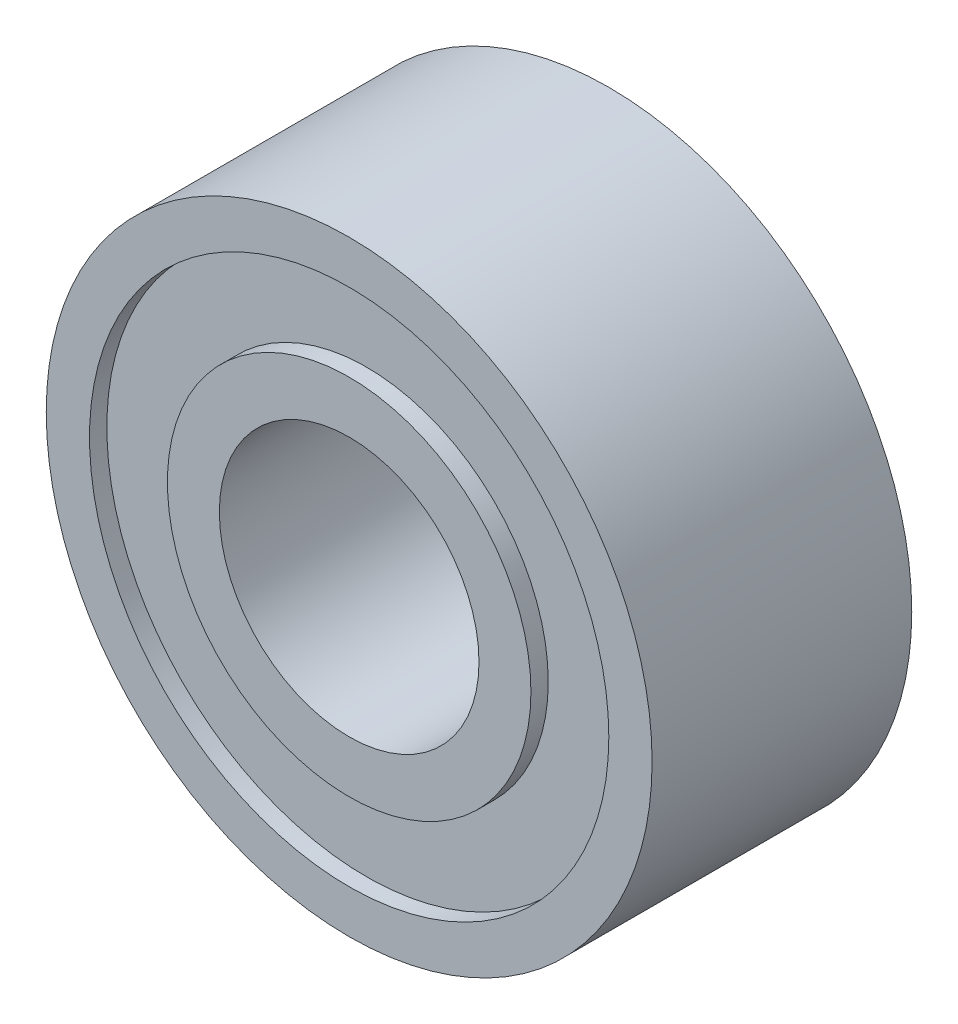
ISO-10303-21;
HEADER;
FILE_DESCRIPTION(('STEP AP214'),'2;1');
FILE_NAME('part.step','',(''),(''),'','','');
FILE_SCHEMA(('AUTOMOTIVE_DESIGN { 1 0 10303 214 1 1 1 1 }'));
ENDSEC;
DATA;
#1=APPLICATION_CONTEXT('core data for automotive mechanical design processes');
#2=APPLICATION_PROTOCOL_DEFINITION('international standard','automotive_design',2000,#1);
#3=PRODUCT_CONTEXT('',#1,'mechanical');
#4=PRODUCT('Part','Part','',(#3));
#5=PRODUCT_RELATED_PRODUCT_CATEGORY('part','',(#4));
#6=PRODUCT_DEFINITION_FORMATION('','',#4);
#7=PRODUCT_DEFINITION_CONTEXT('part definition',#1,'design');
#8=PRODUCT_DEFINITION('design','',#6,#7);
#9=PRODUCT_DEFINITION_SHAPE('','',#8);
#10=(LENGTH_UNIT() NAMED_UNIT(*) SI_UNIT(.MILLI.,.METRE.));
#11=(NAMED_UNIT(*) PLANE_ANGLE_UNIT() SI_UNIT($,.RADIAN.));
#12=(NAMED_UNIT(*) SI_UNIT($,.STERADIAN.) SOLID_ANGLE_UNIT());
#13=UNCERTAINTY_MEASURE_WITH_UNIT(LENGTH_MEASURE(1.E-05),#10,'distance_accuracy_value','');
#14=(GEOMETRIC_REPRESENTATION_CONTEXT(3) GLOBAL_UNCERTAINTY_ASSIGNED_CONTEXT((#13)) GLOBAL_UNIT_ASSIGNED_CONTEXT((#10,
#11,#12)) REPRESENTATION_CONTEXT('',''));
#15=CARTESIAN_POINT('',(0.,0.,0.));
#16=DIRECTION('',(0.,0.,1.));
#17=DIRECTION('',(1.,0.,0.));
#18=AXIS2_PLACEMENT_3D('',#15,#16,#17);
#19=CARTESIAN_POINT('',(0.,0.,0.));
#20=DIRECTION('',(0.,0.,1.));
#21=DIRECTION('',(1.,0.,0.));
#22=AXIS2_PLACEMENT_3D('',#19,#20,#21);
#23=PLANE('',#22);
#24=CARTESIAN_POINT('',(0.,0.,0.));
#25=DIRECTION('',(0.,0.,1.));
#26=DIRECTION('',(1.,0.,0.));
#27=AXIS2_PLACEMENT_3D('',#24,#25,#26);
#28=CIRCLE('',#27,7.5);
#29=CARTESIAN_POINT('',(7.5,0.,0.));
#30=VERTEX_POINT('',#29);
#31=EDGE_CURVE('E44',#30,#30,#28,.T.);
#32=ORIENTED_EDGE('',*,*,#31,.T.);
#33=EDGE_LOOP('',(#32));
#34=FACE_BOUND('',#33,.T.);
#35=CARTESIAN_POINT('',(0.,0.,0.));
#36=DIRECTION('',(0.,0.,-1.));
#37=DIRECTION('',(-1.,0.,0.));
#38=AXIS2_PLACEMENT_3D('',#35,#36,#37);
#39=CIRCLE('',#38,10.5);
#40=CARTESIAN_POINT('',(-10.5,0.,0.));
#41=VERTEX_POINT('',#40);
#42=EDGE_CURVE('E68',#41,#41,#39,.T.);
#43=ORIENTED_EDGE('',*,*,#42,.T.);
#44=EDGE_LOOP('',(#43));
#45=FACE_BOUND('',#44,.T.);
#46=ADVANCED_FACE('F31',(#34,#45),#23,.F.);
#47=CARTESIAN_POINT('',(0.,0.,15.));
#48=DIRECTION('',(0.,0.,1.));
#49=DIRECTION('',(1.,0.,0.));
#50=AXIS2_PLACEMENT_3D('',#47,#48,#49);
#51=PLANE('',#50);
#52=CARTESIAN_POINT('',(0.,0.,15.));
#53=DIRECTION('',(0.,0.,1.));
#54=DIRECTION('',(1.,0.,0.));
#55=AXIS2_PLACEMENT_3D('',#52,#53,#54);
#56=CIRCLE('',#55,7.5);
#57=CARTESIAN_POINT('',(7.5,0.,15.));
#58=VERTEX_POINT('',#57);
#59=EDGE_CURVE('E42',#58,#58,#56,.T.);
#60=ORIENTED_EDGE('',*,*,#59,.F.);
#61=EDGE_LOOP('',(#60));
#62=FACE_BOUND('',#61,.T.);
#63=CARTESIAN_POINT('',(0.,0.,15.));
#64=DIRECTION('',(0.,0.,1.));
#65=DIRECTION('',(1.,0.,0.));
#66=AXIS2_PLACEMENT_3D('',#63,#64,#65);
#67=CIRCLE('',#66,10.5);
#68=CARTESIAN_POINT('',(10.5,0.,15.));
#69=VERTEX_POINT('',#68);
#70=EDGE_CURVE('E56',#69,#69,#67,.T.);
#71=ORIENTED_EDGE('',*,*,#70,.T.);
#72=EDGE_LOOP('',(#71));
#73=FACE_BOUND('',#72,.T.);
#74=ADVANCED_FACE('F106',(#62,#73),#51,.T.);
#75=CARTESIAN_POINT('',(0.,0.,15.));
#76=DIRECTION('',(0.,0.,1.));
#77=DIRECTION('',(1.,0.,0.));
#78=AXIS2_PLACEMENT_3D('',#75,#76,#77);
#79=CIRCLE('',#78,15.);
#80=CARTESIAN_POINT('',(15.,0.,15.));
#81=VERTEX_POINT('',#80);
#82=EDGE_CURVE('E50',#81,#81,#79,.T.);
#83=ORIENTED_EDGE('',*,*,#82,.F.);
#84=EDGE_LOOP('',(#83));
#85=FACE_BOUND('',#84,.T.);
#86=CARTESIAN_POINT('',(0.,0.,15.));
#87=DIRECTION('',(0.,0.,1.));
#88=DIRECTION('',(1.,0.,0.));
#89=AXIS2_PLACEMENT_3D('',#86,#87,#88);
#90=CIRCLE('',#89,17.5);
#91=CARTESIAN_POINT('',(17.5,0.,15.));
#92=VERTEX_POINT('',#91);
#93=EDGE_CURVE('E10',#92,#92,#90,.T.);
#94=ORIENTED_EDGE('',*,*,#93,.T.);
#95=EDGE_LOOP('',(#94));
#96=FACE_BOUND('',#95,.T.);
#97=ADVANCED_FACE('F93',(#85,#96),#51,.T.);
#98=CARTESIAN_POINT('',(0.,0.,0.));
#99=DIRECTION('',(0.,0.,-1.));
#100=DIRECTION('',(-1.,0.,0.));
#101=AXIS2_PLACEMENT_3D('',#98,#99,#100);
#102=CIRCLE('',#101,15.);
#103=CARTESIAN_POINT('',(-15.,0.,0.));
#104=VERTEX_POINT('',#103);
#105=EDGE_CURVE('E62',#104,#104,#102,.T.);
#106=ORIENTED_EDGE('',*,*,#105,.F.);
#107=EDGE_LOOP('',(#106));
#108=FACE_BOUND('',#107,.T.);
#109=CARTESIAN_POINT('',(0.,0.,0.));
#110=DIRECTION('',(0.,0.,1.));
#111=DIRECTION('',(1.,0.,0.));
#112=AXIS2_PLACEMENT_3D('',#109,#110,#111);
#113=CIRCLE('',#112,17.5);
#114=CARTESIAN_POINT('',(17.5,0.,0.));
#115=VERTEX_POINT('',#114);
#116=EDGE_CURVE('E35',#115,#115,#113,.T.);
#117=ORIENTED_EDGE('',*,*,#116,.F.);
#118=EDGE_LOOP('',(#117));
#119=FACE_BOUND('',#118,.T.);
#120=ADVANCED_FACE('F90',(#108,#119),#23,.F.);
#121=CARTESIAN_POINT('',(0.,0.,15.));
#122=DIRECTION('',(0.,0.,-1.));
#123=DIRECTION('',(-1.,0.,0.));
#124=AXIS2_PLACEMENT_3D('',#121,#122,#123);
#125=CYLINDRICAL_SURFACE('',#124,17.5);
#126=ORIENTED_EDGE('',*,*,#93,.F.);
#127=EDGE_LOOP('',(#126));
#128=FACE_BOUND('',#127,.T.);
#129=ORIENTED_EDGE('',*,*,#116,.T.);
#130=EDGE_LOOP('',(#129));
#131=FACE_BOUND('',#130,.T.);
#132=ADVANCED_FACE('F33',(#128,#131),#125,.T.);
#133=CARTESIAN_POINT('',(0.,0.,15.));
#134=DIRECTION('',(0.,0.,-1.));
#135=DIRECTION('',(-1.,0.,0.));
#136=AXIS2_PLACEMENT_3D('',#133,#134,#135);
#137=CYLINDRICAL_SURFACE('',#136,7.5);
#138=ORIENTED_EDGE('',*,*,#59,.T.);
#139=EDGE_LOOP('',(#138));
#140=FACE_BOUND('',#139,.T.);
#141=ORIENTED_EDGE('',*,*,#31,.F.);
#142=EDGE_LOOP('',(#141));
#143=FACE_BOUND('',#142,.T.);
#144=ADVANCED_FACE('F97',(#140,#143),#137,.F.);
#145=CARTESIAN_POINT('',(0.,0.,14.));
#146=DIRECTION('',(0.,0.,1.));
#147=DIRECTION('',(1.,0.,0.));
#148=AXIS2_PLACEMENT_3D('',#145,#146,#147);
#149=CYLINDRICAL_SURFACE('',#148,15.);
#150=CARTESIAN_POINT('',(0.,0.,14.));
#151=DIRECTION('',(0.,0.,1.));
#152=DIRECTION('',(1.,0.,0.));
#153=AXIS2_PLACEMENT_3D('',#150,#151,#152);
#154=CIRCLE('',#153,15.);
#155=CARTESIAN_POINT('',(15.,0.,14.));
#156=VERTEX_POINT('',#155);
#157=EDGE_CURVE('E47',#156,#156,#154,.T.);
#158=ORIENTED_EDGE('',*,*,#157,.F.);
#159=EDGE_LOOP('',(#158));
#160=FACE_BOUND('',#159,.T.);
#161=ORIENTED_EDGE('',*,*,#82,.T.);
#162=EDGE_LOOP('',(#161));
#163=FACE_BOUND('',#162,.T.);
#164=ADVANCED_FACE('F102',(#160,#163),#149,.F.);
#165=CARTESIAN_POINT('',(0.,0.,14.));
#166=DIRECTION('',(0.,0.,1.));
#167=DIRECTION('',(1.,0.,0.));
#168=AXIS2_PLACEMENT_3D('',#165,#166,#167);
#169=PLANE('',#168);
#170=CARTESIAN_POINT('',(0.,0.,14.));
#171=DIRECTION('',(0.,0.,1.));
#172=DIRECTION('',(1.,0.,0.));
#173=AXIS2_PLACEMENT_3D('',#170,#171,#172);
#174=CIRCLE('',#173,10.5);
#175=CARTESIAN_POINT('',(10.5,0.,14.));
#176=VERTEX_POINT('',#175);
#177=EDGE_CURVE('E53',#176,#176,#174,.T.);
#178=ORIENTED_EDGE('',*,*,#177,.F.);
#179=EDGE_LOOP('',(#178));
#180=FACE_BOUND('',#179,.T.);
#181=ORIENTED_EDGE('',*,*,#157,.T.);
#182=EDGE_LOOP('',(#181));
#183=FACE_BOUND('',#182,.T.);
#184=ADVANCED_FACE('F119',(#180,#183),#169,.T.);
#185=CARTESIAN_POINT('',(0.,0.,14.));
#186=DIRECTION('',(0.,0.,1.));
#187=DIRECTION('',(1.,0.,0.));
#188=AXIS2_PLACEMENT_3D('',#185,#186,#187);
#189=CYLINDRICAL_SURFACE('',#188,10.5);
#190=ORIENTED_EDGE('',*,*,#177,.T.);
#191=EDGE_LOOP('',(#190));
#192=FACE_BOUND('',#191,.T.);
#193=ORIENTED_EDGE('',*,*,#70,.F.);
#194=EDGE_LOOP('',(#193));
#195=FACE_BOUND('',#194,.T.);
#196=ADVANCED_FACE('F86',(#192,#195),#189,.T.);
#197=CARTESIAN_POINT('',(0.,0.,1.));
#198=DIRECTION('',(0.,0.,-1.));
#199=DIRECTION('',(-1.,0.,0.));
#200=AXIS2_PLACEMENT_3D('',#197,#198,#199);
#201=CYLINDRICAL_SURFACE('',#200,15.);
#202=CARTESIAN_POINT('',(0.,0.,1.));
#203=DIRECTION('',(0.,0.,-1.));
#204=DIRECTION('',(-1.,0.,0.));
#205=AXIS2_PLACEMENT_3D('',#202,#203,#204);
#206=CIRCLE('',#205,15.);
#207=CARTESIAN_POINT('',(-15.,0.,1.));
#208=VERTEX_POINT('',#207);
#209=EDGE_CURVE('E59',#208,#208,#206,.T.);
#210=ORIENTED_EDGE('',*,*,#209,.F.);
#211=EDGE_LOOP('',(#210));
#212=FACE_BOUND('',#211,.T.);
#213=ORIENTED_EDGE('',*,*,#105,.T.);
#214=EDGE_LOOP('',(#213));
#215=FACE_BOUND('',#214,.T.);
#216=ADVANCED_FACE('F80',(#212,#215),#201,.F.);
#217=CARTESIAN_POINT('',(0.,0.,1.));
#218=DIRECTION('',(0.,0.,-1.));
#219=DIRECTION('',(-1.,0.,0.));
#220=AXIS2_PLACEMENT_3D('',#217,#218,#219);
#221=PLANE('',#220);
#222=CARTESIAN_POINT('',(0.,0.,1.));
#223=DIRECTION('',(0.,0.,-1.));
#224=DIRECTION('',(-1.,0.,0.));
#225=AXIS2_PLACEMENT_3D('',#222,#223,#224);
#226=CIRCLE('',#225,10.5);
#227=CARTESIAN_POINT('',(-10.5,0.,1.));
#228=VERTEX_POINT('',#227);
#229=EDGE_CURVE('E65',#228,#228,#226,.T.);
#230=ORIENTED_EDGE('',*,*,#229,.F.);
#231=EDGE_LOOP('',(#230));
#232=FACE_BOUND('',#231,.T.);
#233=ORIENTED_EDGE('',*,*,#209,.T.);
#234=EDGE_LOOP('',(#233));
#235=FACE_BOUND('',#234,.T.);
#236=ADVANCED_FACE('F77',(#232,#235),#221,.T.);
#237=CARTESIAN_POINT('',(0.,0.,1.));
#238=DIRECTION('',(0.,0.,-1.));
#239=DIRECTION('',(-1.,0.,0.));
#240=AXIS2_PLACEMENT_3D('',#237,#238,#239);
#241=CYLINDRICAL_SURFACE('',#240,10.5);
#242=ORIENTED_EDGE('',*,*,#229,.T.);
#243=EDGE_LOOP('',(#242));
#244=FACE_BOUND('',#243,.T.);
#245=ORIENTED_EDGE('',*,*,#42,.F.);
#246=EDGE_LOOP('',(#245));
#247=FACE_BOUND('',#246,.T.);
#248=ADVANCED_FACE('F74',(#244,#247),#241,.T.);
#249=CLOSED_SHELL('',(#46,#74,#97,#120,#132,#144,#164,#184,#196,#216,#236,#248));
#250=MANIFOLD_SOLID_BREP('B2',#249);
#251=ADVANCED_BREP_SHAPE_REPRESENTATION('',(#18,#250),#14);
#252=SHAPE_DEFINITION_REPRESENTATION(#9,#251);
ENDSEC;
END-ISO-10303-21;
